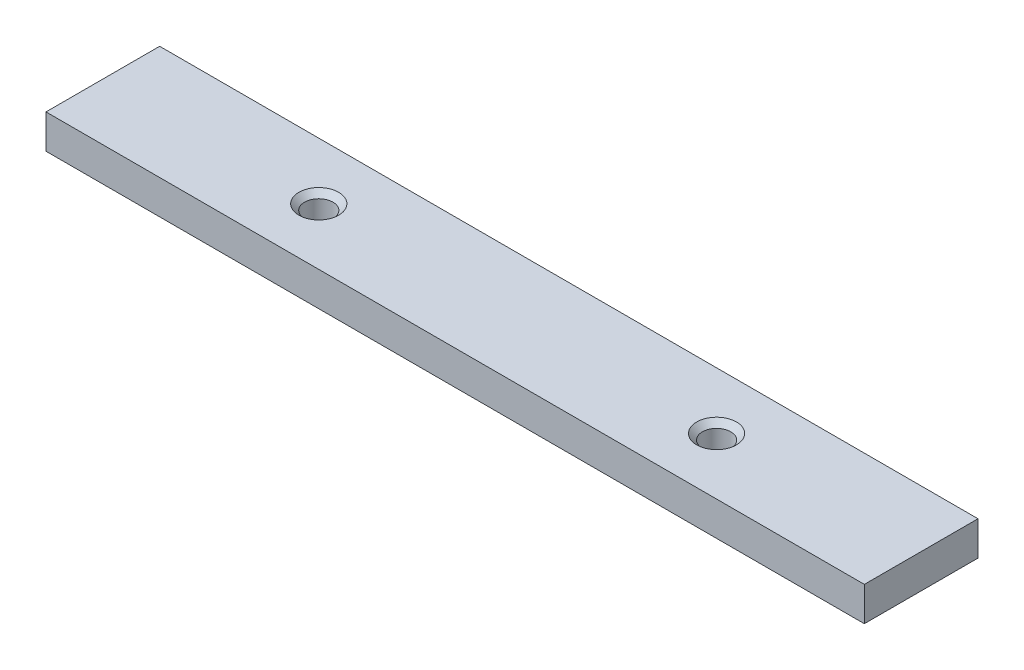
ISO-10303-21;
HEADER;
FILE_DESCRIPTION(('STEP AP214'),'2;1');
FILE_NAME('part.step','',(''),(''),'','','');
FILE_SCHEMA(('AUTOMOTIVE_DESIGN { 1 0 10303 214 1 1 1 1 }'));
ENDSEC;
DATA;
#1=APPLICATION_CONTEXT('core data for automotive mechanical design processes');
#2=APPLICATION_PROTOCOL_DEFINITION('international standard','automotive_design',2000,#1);
#3=PRODUCT_CONTEXT('',#1,'mechanical');
#4=PRODUCT('Part','Part','',(#3));
#5=PRODUCT_RELATED_PRODUCT_CATEGORY('part','',(#4));
#6=PRODUCT_DEFINITION_FORMATION('','',#4);
#7=PRODUCT_DEFINITION_CONTEXT('part definition',#1,'design');
#8=PRODUCT_DEFINITION('design','',#6,#7);
#9=PRODUCT_DEFINITION_SHAPE('','',#8);
#10=(LENGTH_UNIT() NAMED_UNIT(*) SI_UNIT(.MILLI.,.METRE.));
#11=(NAMED_UNIT(*) PLANE_ANGLE_UNIT() SI_UNIT($,.RADIAN.));
#12=(NAMED_UNIT(*) SI_UNIT($,.STERADIAN.) SOLID_ANGLE_UNIT());
#13=UNCERTAINTY_MEASURE_WITH_UNIT(LENGTH_MEASURE(1.E-05),#10,'distance_accuracy_value','');
#14=(GEOMETRIC_REPRESENTATION_CONTEXT(3) GLOBAL_UNCERTAINTY_ASSIGNED_CONTEXT((#13)) GLOBAL_UNIT_ASSIGNED_CONTEXT((#10,
#11,#12)) REPRESENTATION_CONTEXT('',''));
#15=CARTESIAN_POINT('',(0.,0.,0.));
#16=DIRECTION('',(0.,0.,1.));
#17=DIRECTION('',(1.,0.,0.));
#18=AXIS2_PLACEMENT_3D('',#15,#16,#17);
#19=CARTESIAN_POINT('',(-72.,3.,-9.99999999999999));
#20=DIRECTION('',(1.,0.,0.));
#21=DIRECTION('',(0.,0.,-1.));
#22=AXIS2_PLACEMENT_3D('',#19,#20,#21);
#23=PLANE('',#22);
#24=DIRECTION('',(0.,0.,1.));
#25=VECTOR('',#24,1.);
#26=CARTESIAN_POINT('',(-72.,-3.,-9.99999999999999));
#27=LINE('',#26,#25);
#28=CARTESIAN_POINT('',(-72.,-3.,-9.99999999999999));
#29=VERTEX_POINT('',#28);
#30=CARTESIAN_POINT('',(-72.,-3.,10.));
#31=VERTEX_POINT('',#30);
#32=EDGE_CURVE('E103',#29,#31,#27,.T.);
#33=ORIENTED_EDGE('',*,*,#32,.T.);
#34=DIRECTION('',(0.,-1.,0.));
#35=VECTOR('',#34,1.);
#36=CARTESIAN_POINT('',(-72.,3.,10.));
#37=LINE('',#36,#35);
#38=CARTESIAN_POINT('',(-72.,3.,10.));
#39=VERTEX_POINT('',#38);
#40=EDGE_CURVE('E11',#39,#31,#37,.T.);
#41=ORIENTED_EDGE('',*,*,#40,.F.);
#42=DIRECTION('',(0.,0.,1.));
#43=VECTOR('',#42,1.);
#44=CARTESIAN_POINT('',(-72.,3.,-9.99999999999999));
#45=LINE('',#44,#43);
#46=CARTESIAN_POINT('',(-72.,3.,-9.99999999999999));
#47=VERTEX_POINT('',#46);
#48=EDGE_CURVE('E91',#47,#39,#45,.T.);
#49=ORIENTED_EDGE('',*,*,#48,.F.);
#50=DIRECTION('',(0.,-1.,0.));
#51=VECTOR('',#50,1.);
#52=CARTESIAN_POINT('',(-72.,3.,-9.99999999999999));
#53=LINE('',#52,#51);
#54=EDGE_CURVE('E99',#47,#29,#53,.T.);
#55=ORIENTED_EDGE('',*,*,#54,.T.);
#56=EDGE_LOOP('',(#33,#41,#49,#55));
#57=FACE_BOUND('',#56,.T.);
#58=ADVANCED_FACE('F40',(#57),#23,.F.);
#59=CARTESIAN_POINT('',(72.,3.,9.99999999999999));
#60=DIRECTION('',(0.,0.,-1.));
#61=DIRECTION('',(-1.,0.,0.));
#62=AXIS2_PLACEMENT_3D('',#59,#60,#61);
#63=PLANE('',#62);
#64=DIRECTION('',(1.,0.,0.));
#65=VECTOR('',#64,1.);
#66=CARTESIAN_POINT('',(72.,-3.,9.99999999999999));
#67=LINE('',#66,#65);
#68=CARTESIAN_POINT('',(72.,-3.,9.99999999999999));
#69=VERTEX_POINT('',#68);
#70=EDGE_CURVE('E95',#31,#69,#67,.T.);
#71=ORIENTED_EDGE('',*,*,#70,.T.);
#72=DIRECTION('',(0.,-1.,0.));
#73=VECTOR('',#72,1.);
#74=CARTESIAN_POINT('',(72.,3.,9.99999999999999));
#75=LINE('',#74,#73);
#76=CARTESIAN_POINT('',(72.,3.,9.99999999999999));
#77=VERTEX_POINT('',#76);
#78=EDGE_CURVE('E48',#77,#69,#75,.T.);
#79=ORIENTED_EDGE('',*,*,#78,.F.);
#80=DIRECTION('',(1.,0.,0.));
#81=VECTOR('',#80,1.);
#82=CARTESIAN_POINT('',(72.,3.,9.99999999999999));
#83=LINE('',#82,#81);
#84=EDGE_CURVE('E86',#39,#77,#83,.T.);
#85=ORIENTED_EDGE('',*,*,#84,.F.);
#86=ORIENTED_EDGE('',*,*,#40,.T.);
#87=EDGE_LOOP('',(#71,#79,#85,#86));
#88=FACE_BOUND('',#87,.T.);
#89=ADVANCED_FACE('F94',(#88),#63,.F.);
#90=CARTESIAN_POINT('',(72.,3.,-10.));
#91=DIRECTION('',(-1.,0.,0.));
#92=DIRECTION('',(0.,0.,1.));
#93=AXIS2_PLACEMENT_3D('',#90,#91,#92);
#94=PLANE('',#93);
#95=DIRECTION('',(0.,0.,-1.));
#96=VECTOR('',#95,1.);
#97=CARTESIAN_POINT('',(72.,-3.,-10.));
#98=LINE('',#97,#96);
#99=CARTESIAN_POINT('',(72.,-3.,-10.));
#100=VERTEX_POINT('',#99);
#101=EDGE_CURVE('E73',#69,#100,#98,.T.);
#102=ORIENTED_EDGE('',*,*,#101,.T.);
#103=DIRECTION('',(0.,-1.,0.));
#104=VECTOR('',#103,1.);
#105=CARTESIAN_POINT('',(72.,3.,-10.));
#106=LINE('',#105,#104);
#107=CARTESIAN_POINT('',(72.,3.,-10.));
#108=VERTEX_POINT('',#107);
#109=EDGE_CURVE('E96',#108,#100,#106,.T.);
#110=ORIENTED_EDGE('',*,*,#109,.F.);
#111=DIRECTION('',(0.,0.,-1.));
#112=VECTOR('',#111,1.);
#113=CARTESIAN_POINT('',(72.,3.,-10.));
#114=LINE('',#113,#112);
#115=EDGE_CURVE('E89',#77,#108,#114,.T.);
#116=ORIENTED_EDGE('',*,*,#115,.F.);
#117=ORIENTED_EDGE('',*,*,#78,.T.);
#118=EDGE_LOOP('',(#102,#110,#116,#117));
#119=FACE_BOUND('',#118,.T.);
#120=ADVANCED_FACE('F97',(#119),#94,.F.);
#121=CARTESIAN_POINT('',(72.,3.,-10.));
#122=DIRECTION('',(0.,0.,1.));
#123=DIRECTION('',(1.,0.,0.));
#124=AXIS2_PLACEMENT_3D('',#121,#122,#123);
#125=PLANE('',#124);
#126=DIRECTION('',(-1.,0.,0.));
#127=VECTOR('',#126,1.);
#128=CARTESIAN_POINT('',(72.,-3.,-10.));
#129=LINE('',#128,#127);
#130=EDGE_CURVE('E79',#100,#29,#129,.T.);
#131=ORIENTED_EDGE('',*,*,#130,.T.);
#132=ORIENTED_EDGE('',*,*,#54,.F.);
#133=DIRECTION('',(-1.,0.,0.));
#134=VECTOR('',#133,1.);
#135=CARTESIAN_POINT('',(72.,3.,-10.));
#136=LINE('',#135,#134);
#137=EDGE_CURVE('E56',#108,#47,#136,.T.);
#138=ORIENTED_EDGE('',*,*,#137,.F.);
#139=ORIENTED_EDGE('',*,*,#109,.T.);
#140=EDGE_LOOP('',(#131,#132,#138,#139));
#141=FACE_BOUND('',#140,.T.);
#142=ADVANCED_FACE('F111',(#141),#125,.F.);
#143=CARTESIAN_POINT('',(0.,3.,0.));
#144=DIRECTION('',(0.,-1.,0.));
#145=DIRECTION('',(0.,0.,-1.));
#146=AXIS2_PLACEMENT_3D('',#143,#144,#145);
#147=PLANE('',#146);
#148=CARTESIAN_POINT('',(-34.,3.,0.));
#149=DIRECTION('',(0.,1.,0.));
#150=DIRECTION('',(0.,0.,1.));
#151=AXIS2_PLACEMENT_3D('',#148,#149,#150);
#152=CIRCLE('',#151,3.499999985);
#153=CARTESIAN_POINT('',(-34.,3.,3.499999985));
#154=VERTEX_POINT('',#153);
#155=EDGE_CURVE('E131',#154,#154,#152,.T.);
#156=ORIENTED_EDGE('',*,*,#155,.F.);
#157=EDGE_LOOP('',(#156));
#158=FACE_BOUND('',#157,.T.);
#159=CARTESIAN_POINT('',(36.,3.,0.));
#160=DIRECTION('',(0.,1.,0.));
#161=DIRECTION('',(0.,0.,1.));
#162=AXIS2_PLACEMENT_3D('',#159,#160,#161);
#163=CIRCLE('',#162,3.499999985);
#164=CARTESIAN_POINT('',(36.,3.,3.499999985));
#165=VERTEX_POINT('',#164);
#166=EDGE_CURVE('E122',#165,#165,#163,.T.);
#167=ORIENTED_EDGE('',*,*,#166,.F.);
#168=EDGE_LOOP('',(#167));
#169=FACE_BOUND('',#168,.T.);
#170=ORIENTED_EDGE('',*,*,#48,.T.);
#171=ORIENTED_EDGE('',*,*,#84,.T.);
#172=ORIENTED_EDGE('',*,*,#115,.T.);
#173=ORIENTED_EDGE('',*,*,#137,.T.);
#174=EDGE_LOOP('',(#170,#171,#172,#173));
#175=FACE_BOUND('',#174,.T.);
#176=ADVANCED_FACE('F87',(#158,#169,#175),#147,.F.);
#177=CARTESIAN_POINT('',(0.,-3.,0.));
#178=DIRECTION('',(0.,-1.,0.));
#179=DIRECTION('',(0.,0.,-1.));
#180=AXIS2_PLACEMENT_3D('',#177,#178,#179);
#181=PLANE('',#180);
#182=CARTESIAN_POINT('',(-34.,-3.,0.));
#183=DIRECTION('',(0.,1.,0.));
#184=DIRECTION('',(0.,0.,1.));
#185=AXIS2_PLACEMENT_3D('',#182,#183,#184);
#186=CIRCLE('',#185,2.499999953);
#187=CARTESIAN_POINT('',(-34.,-3.,2.499999953));
#188=VERTEX_POINT('',#187);
#189=EDGE_CURVE('E125',#188,#188,#186,.T.);
#190=ORIENTED_EDGE('',*,*,#189,.T.);
#191=EDGE_LOOP('',(#190));
#192=FACE_BOUND('',#191,.T.);
#193=CARTESIAN_POINT('',(36.,-3.,0.));
#194=DIRECTION('',(0.,1.,0.));
#195=DIRECTION('',(0.,0.,1.));
#196=AXIS2_PLACEMENT_3D('',#193,#194,#195);
#197=CIRCLE('',#196,2.499999953);
#198=CARTESIAN_POINT('',(36.,-3.,2.499999953));
#199=VERTEX_POINT('',#198);
#200=EDGE_CURVE('E106',#199,#199,#197,.T.);
#201=ORIENTED_EDGE('',*,*,#200,.T.);
#202=EDGE_LOOP('',(#201));
#203=FACE_BOUND('',#202,.T.);
#204=ORIENTED_EDGE('',*,*,#32,.F.);
#205=ORIENTED_EDGE('',*,*,#130,.F.);
#206=ORIENTED_EDGE('',*,*,#101,.F.);
#207=ORIENTED_EDGE('',*,*,#70,.F.);
#208=EDGE_LOOP('',(#204,#205,#206,#207));
#209=FACE_BOUND('',#208,.T.);
#210=ADVANCED_FACE('F114',(#192,#203,#209),#181,.T.);
#211=CARTESIAN_POINT('',(36.,3.,0.));
#212=DIRECTION('',(0.,1.,0.));
#213=DIRECTION('',(0.,0.,1.));
#214=AXIS2_PLACEMENT_3D('',#211,#212,#213);
#215=CYLINDRICAL_SURFACE('',#214,2.499999953);
#216=ORIENTED_EDGE('',*,*,#200,.F.);
#217=EDGE_LOOP('',(#216));
#218=FACE_BOUND('',#217,.T.);
#219=CARTESIAN_POINT('',(36.,1.999999968,0.));
#220=DIRECTION('',(0.,1.,0.));
#221=DIRECTION('',(0.,0.,1.));
#222=AXIS2_PLACEMENT_3D('',#219,#220,#221);
#223=CIRCLE('',#222,2.499999953);
#224=CARTESIAN_POINT('',(36.,1.999999968,2.499999953));
#225=VERTEX_POINT('',#224);
#226=EDGE_CURVE('E119',#225,#225,#223,.T.);
#227=ORIENTED_EDGE('',*,*,#226,.T.);
#228=EDGE_LOOP('',(#227));
#229=FACE_BOUND('',#228,.T.);
#230=ADVANCED_FACE('F145',(#218,#229),#215,.F.);
#231=CARTESIAN_POINT('',(36.,3.,0.));
#232=DIRECTION('',(0.,1.,0.));
#233=DIRECTION('',(0.,0.,1.));
#234=AXIS2_PLACEMENT_3D('',#231,#232,#233);
#235=CONICAL_SURFACE('',#234,3.499999985,0.785398163397448);
#236=ORIENTED_EDGE('',*,*,#226,.F.);
#237=EDGE_LOOP('',(#236));
#238=FACE_BOUND('',#237,.T.);
#239=ORIENTED_EDGE('',*,*,#166,.T.);
#240=EDGE_LOOP('',(#239));
#241=FACE_BOUND('',#240,.T.);
#242=ADVANCED_FACE('F142',(#238,#241),#235,.F.);
#243=CARTESIAN_POINT('',(-34.,3.,0.));
#244=DIRECTION('',(0.,1.,0.));
#245=DIRECTION('',(0.,0.,1.));
#246=AXIS2_PLACEMENT_3D('',#243,#244,#245);
#247=CYLINDRICAL_SURFACE('',#246,2.499999953);
#248=ORIENTED_EDGE('',*,*,#189,.F.);
#249=EDGE_LOOP('',(#248));
#250=FACE_BOUND('',#249,.T.);
#251=CARTESIAN_POINT('',(-34.,1.999999968,0.));
#252=DIRECTION('',(0.,1.,0.));
#253=DIRECTION('',(0.,0.,1.));
#254=AXIS2_PLACEMENT_3D('',#251,#252,#253);
#255=CIRCLE('',#254,2.499999953);
#256=CARTESIAN_POINT('',(-34.,1.999999968,2.499999953));
#257=VERTEX_POINT('',#256);
#258=EDGE_CURVE('E128',#257,#257,#255,.T.);
#259=ORIENTED_EDGE('',*,*,#258,.T.);
#260=EDGE_LOOP('',(#259));
#261=FACE_BOUND('',#260,.T.);
#262=ADVANCED_FACE('F144',(#250,#261),#247,.F.);
#263=CARTESIAN_POINT('',(-34.,3.,0.));
#264=DIRECTION('',(0.,1.,0.));
#265=DIRECTION('',(0.,0.,1.));
#266=AXIS2_PLACEMENT_3D('',#263,#264,#265);
#267=CONICAL_SURFACE('',#266,3.499999985,0.785398163397447);
#268=ORIENTED_EDGE('',*,*,#258,.F.);
#269=EDGE_LOOP('',(#268));
#270=FACE_BOUND('',#269,.T.);
#271=ORIENTED_EDGE('',*,*,#155,.T.);
#272=EDGE_LOOP('',(#271));
#273=FACE_BOUND('',#272,.T.);
#274=ADVANCED_FACE('F135',(#270,#273),#267,.F.);
#275=CLOSED_SHELL('',(#58,#89,#120,#142,#176,#210,#230,#242,#262,#274));
#276=MANIFOLD_SOLID_BREP('B2',#275);
#277=ADVANCED_BREP_SHAPE_REPRESENTATION('',(#18,#276),#14);
#278=SHAPE_DEFINITION_REPRESENTATION(#9,#277);
ENDSEC;
END-ISO-10303-21;
